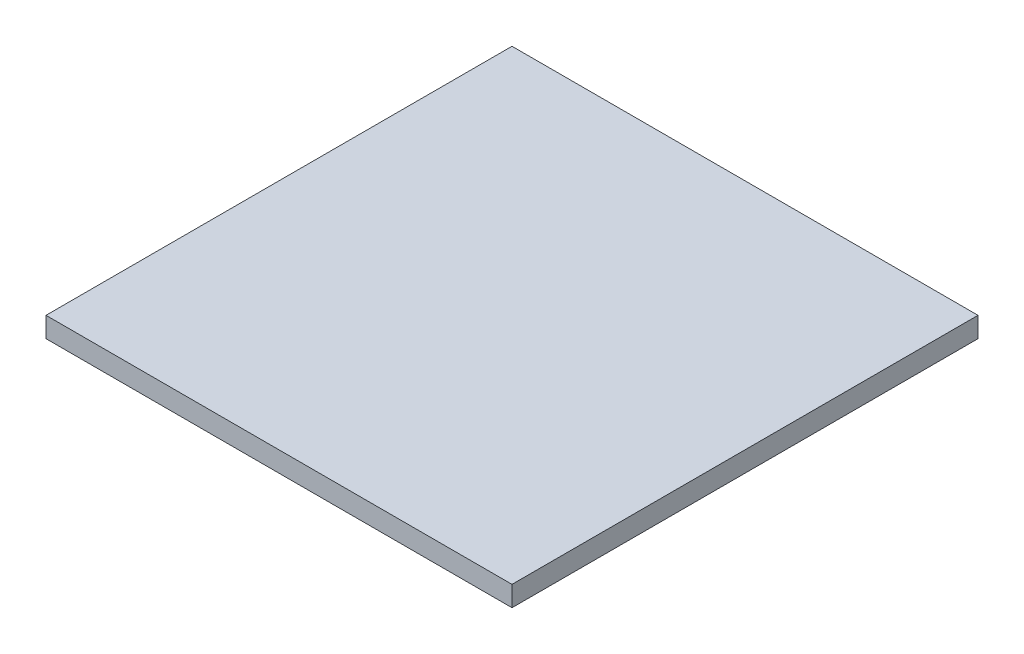
ISO-10303-21;
HEADER;
FILE_DESCRIPTION(('STEP AP214'),'2;1');
FILE_NAME('part.step','',(''),(''),'','','');
FILE_SCHEMA(('AUTOMOTIVE_DESIGN { 1 0 10303 214 1 1 1 1 }'));
ENDSEC;
DATA;
#1=APPLICATION_CONTEXT('core data for automotive mechanical design processes');
#2=APPLICATION_PROTOCOL_DEFINITION('international standard','automotive_design',2000,#1);
#3=PRODUCT_CONTEXT('',#1,'mechanical');
#4=PRODUCT('Part','Part','',(#3));
#5=PRODUCT_RELATED_PRODUCT_CATEGORY('part','',(#4));
#6=PRODUCT_DEFINITION_FORMATION('','',#4);
#7=PRODUCT_DEFINITION_CONTEXT('part definition',#1,'design');
#8=PRODUCT_DEFINITION('design','',#6,#7);
#9=PRODUCT_DEFINITION_SHAPE('','',#8);
#10=(LENGTH_UNIT() NAMED_UNIT(*) SI_UNIT(.MILLI.,.METRE.));
#11=(NAMED_UNIT(*) PLANE_ANGLE_UNIT() SI_UNIT($,.RADIAN.));
#12=(NAMED_UNIT(*) SI_UNIT($,.STERADIAN.) SOLID_ANGLE_UNIT());
#13=UNCERTAINTY_MEASURE_WITH_UNIT(LENGTH_MEASURE(1.E-05),#10,'distance_accuracy_value','');
#14=(GEOMETRIC_REPRESENTATION_CONTEXT(3) GLOBAL_UNCERTAINTY_ASSIGNED_CONTEXT((#13)) GLOBAL_UNIT_ASSIGNED_CONTEXT((#10,
#11,#12)) REPRESENTATION_CONTEXT('',''));
#15=CARTESIAN_POINT('',(0.,0.,0.));
#16=DIRECTION('',(0.,0.,1.));
#17=DIRECTION('',(1.,0.,0.));
#18=AXIS2_PLACEMENT_3D('',#15,#16,#17);
#19=CARTESIAN_POINT('',(0.,12.,0.));
#20=DIRECTION('',(1.,0.,0.));
#21=DIRECTION('',(0.,0.,-1.));
#22=AXIS2_PLACEMENT_3D('',#19,#20,#21);
#23=PLANE('',#22);
#24=DIRECTION('',(0.,0.,1.));
#25=VECTOR('',#24,1.);
#26=CARTESIAN_POINT('',(0.,0.,0.));
#27=LINE('',#26,#25);
#28=CARTESIAN_POINT('',(0.,0.,-276.));
#29=VERTEX_POINT('',#28);
#30=CARTESIAN_POINT('',(0.,0.,0.));
#31=VERTEX_POINT('',#30);
#32=EDGE_CURVE('E100',#29,#31,#27,.T.);
#33=ORIENTED_EDGE('',*,*,#32,.T.);
#34=DIRECTION('',(0.,-1.,0.));
#35=VECTOR('',#34,1.);
#36=CARTESIAN_POINT('',(0.,12.,0.));
#37=LINE('',#36,#35);
#38=CARTESIAN_POINT('',(0.,12.,0.));
#39=VERTEX_POINT('',#38);
#40=EDGE_CURVE('E11',#39,#31,#37,.T.);
#41=ORIENTED_EDGE('',*,*,#40,.F.);
#42=DIRECTION('',(0.,0.,1.));
#43=VECTOR('',#42,1.);
#44=CARTESIAN_POINT('',(0.,12.,0.));
#45=LINE('',#44,#43);
#46=CARTESIAN_POINT('',(0.,12.,-276.));
#47=VERTEX_POINT('',#46);
#48=EDGE_CURVE('E88',#47,#39,#45,.T.);
#49=ORIENTED_EDGE('',*,*,#48,.F.);
#50=DIRECTION('',(0.,-1.,0.));
#51=VECTOR('',#50,1.);
#52=CARTESIAN_POINT('',(0.,12.,-276.));
#53=LINE('',#52,#51);
#54=EDGE_CURVE('E96',#47,#29,#53,.T.);
#55=ORIENTED_EDGE('',*,*,#54,.T.);
#56=EDGE_LOOP('',(#33,#41,#49,#55));
#57=FACE_BOUND('',#56,.T.);
#58=ADVANCED_FACE('F37',(#57),#23,.F.);
#59=CARTESIAN_POINT('',(0.,12.,0.));
#60=DIRECTION('',(0.,0.,-1.));
#61=DIRECTION('',(-1.,0.,0.));
#62=AXIS2_PLACEMENT_3D('',#59,#60,#61);
#63=PLANE('',#62);
#64=DIRECTION('',(1.,0.,0.));
#65=VECTOR('',#64,1.);
#66=CARTESIAN_POINT('',(0.,0.,0.));
#67=LINE('',#66,#65);
#68=CARTESIAN_POINT('',(276.,0.,0.));
#69=VERTEX_POINT('',#68);
#70=EDGE_CURVE('E92',#31,#69,#67,.T.);
#71=ORIENTED_EDGE('',*,*,#70,.T.);
#72=DIRECTION('',(0.,-1.,0.));
#73=VECTOR('',#72,1.);
#74=CARTESIAN_POINT('',(276.,12.,0.));
#75=LINE('',#74,#73);
#76=CARTESIAN_POINT('',(276.,12.,0.));
#77=VERTEX_POINT('',#76);
#78=EDGE_CURVE('E45',#77,#69,#75,.T.);
#79=ORIENTED_EDGE('',*,*,#78,.F.);
#80=DIRECTION('',(1.,0.,0.));
#81=VECTOR('',#80,1.);
#82=CARTESIAN_POINT('',(0.,12.,0.));
#83=LINE('',#82,#81);
#84=EDGE_CURVE('E83',#39,#77,#83,.T.);
#85=ORIENTED_EDGE('',*,*,#84,.F.);
#86=ORIENTED_EDGE('',*,*,#40,.T.);
#87=EDGE_LOOP('',(#71,#79,#85,#86));
#88=FACE_BOUND('',#87,.T.);
#89=ADVANCED_FACE('F91',(#88),#63,.F.);
#90=CARTESIAN_POINT('',(276.,12.,0.));
#91=DIRECTION('',(-1.,0.,0.));
#92=DIRECTION('',(0.,0.,1.));
#93=AXIS2_PLACEMENT_3D('',#90,#91,#92);
#94=PLANE('',#93);
#95=DIRECTION('',(0.,0.,-1.));
#96=VECTOR('',#95,1.);
#97=CARTESIAN_POINT('',(276.,0.,0.));
#98=LINE('',#97,#96);
#99=CARTESIAN_POINT('',(276.,0.,-276.));
#100=VERTEX_POINT('',#99);
#101=EDGE_CURVE('E70',#69,#100,#98,.T.);
#102=ORIENTED_EDGE('',*,*,#101,.T.);
#103=DIRECTION('',(0.,-1.,0.));
#104=VECTOR('',#103,1.);
#105=CARTESIAN_POINT('',(276.,12.,-276.));
#106=LINE('',#105,#104);
#107=CARTESIAN_POINT('',(276.,12.,-276.));
#108=VERTEX_POINT('',#107);
#109=EDGE_CURVE('E93',#108,#100,#106,.T.);
#110=ORIENTED_EDGE('',*,*,#109,.F.);
#111=DIRECTION('',(0.,0.,-1.));
#112=VECTOR('',#111,1.);
#113=CARTESIAN_POINT('',(276.,12.,0.));
#114=LINE('',#113,#112);
#115=EDGE_CURVE('E86',#77,#108,#114,.T.);
#116=ORIENTED_EDGE('',*,*,#115,.F.);
#117=ORIENTED_EDGE('',*,*,#78,.T.);
#118=EDGE_LOOP('',(#102,#110,#116,#117));
#119=FACE_BOUND('',#118,.T.);
#120=ADVANCED_FACE('F94',(#119),#94,.F.);
#121=CARTESIAN_POINT('',(0.,12.,-276.));
#122=DIRECTION('',(0.,0.,1.));
#123=DIRECTION('',(1.,0.,0.));
#124=AXIS2_PLACEMENT_3D('',#121,#122,#123);
#125=PLANE('',#124);
#126=DIRECTION('',(-1.,0.,0.));
#127=VECTOR('',#126,1.);
#128=CARTESIAN_POINT('',(0.,0.,-276.));
#129=LINE('',#128,#127);
#130=EDGE_CURVE('E76',#100,#29,#129,.T.);
#131=ORIENTED_EDGE('',*,*,#130,.T.);
#132=ORIENTED_EDGE('',*,*,#54,.F.);
#133=DIRECTION('',(-1.,0.,0.));
#134=VECTOR('',#133,1.);
#135=CARTESIAN_POINT('',(0.,12.,-276.));
#136=LINE('',#135,#134);
#137=EDGE_CURVE('E53',#108,#47,#136,.T.);
#138=ORIENTED_EDGE('',*,*,#137,.F.);
#139=ORIENTED_EDGE('',*,*,#109,.T.);
#140=EDGE_LOOP('',(#131,#132,#138,#139));
#141=FACE_BOUND('',#140,.T.);
#142=ADVANCED_FACE('F107',(#141),#125,.F.);
#143=CARTESIAN_POINT('',(0.,12.,0.));
#144=DIRECTION('',(0.,-1.,0.));
#145=DIRECTION('',(0.,0.,-1.));
#146=AXIS2_PLACEMENT_3D('',#143,#144,#145);
#147=PLANE('',#146);
#148=ORIENTED_EDGE('',*,*,#48,.T.);
#149=ORIENTED_EDGE('',*,*,#84,.T.);
#150=ORIENTED_EDGE('',*,*,#115,.T.);
#151=ORIENTED_EDGE('',*,*,#137,.T.);
#152=EDGE_LOOP('',(#148,#149,#150,#151));
#153=FACE_BOUND('',#152,.T.);
#154=ADVANCED_FACE('F84',(#153),#147,.F.);
#155=CARTESIAN_POINT('',(0.,0.,0.));
#156=DIRECTION('',(0.,-1.,0.));
#157=DIRECTION('',(0.,0.,-1.));
#158=AXIS2_PLACEMENT_3D('',#155,#156,#157);
#159=PLANE('',#158);
#160=ORIENTED_EDGE('',*,*,#32,.F.);
#161=ORIENTED_EDGE('',*,*,#130,.F.);
#162=ORIENTED_EDGE('',*,*,#101,.F.);
#163=ORIENTED_EDGE('',*,*,#70,.F.);
#164=EDGE_LOOP('',(#160,#161,#162,#163));
#165=FACE_BOUND('',#164,.T.);
#166=ADVANCED_FACE('F110',(#165),#159,.T.);
#167=CLOSED_SHELL('',(#58,#89,#120,#142,#154,#166));
#168=MANIFOLD_SOLID_BREP('B2',#167);
#169=ADVANCED_BREP_SHAPE_REPRESENTATION('',(#18,#168),#14);
#170=SHAPE_DEFINITION_REPRESENTATION(#9,#169);
ENDSEC;
END-ISO-10303-21;
